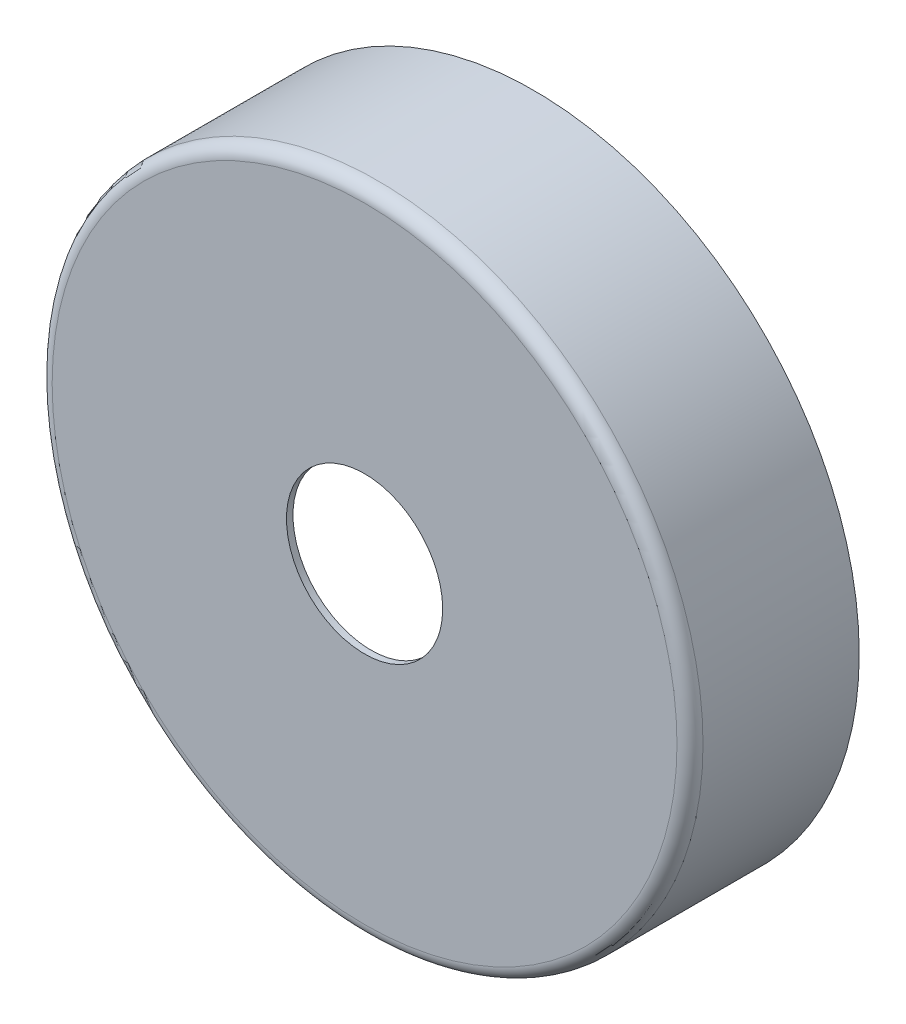
ISO-10303-21;
HEADER;
FILE_DESCRIPTION(('STEP AP214'),'2;1');
FILE_NAME('part.step','',(''),(''),'','','');
FILE_SCHEMA(('AUTOMOTIVE_DESIGN { 1 0 10303 214 1 1 1 1 }'));
ENDSEC;
DATA;
#1=APPLICATION_CONTEXT('core data for automotive mechanical design processes');
#2=APPLICATION_PROTOCOL_DEFINITION('international standard','automotive_design',2000,#1);
#3=PRODUCT_CONTEXT('',#1,'mechanical');
#4=PRODUCT('Part','Part','',(#3));
#5=PRODUCT_RELATED_PRODUCT_CATEGORY('part','',(#4));
#6=PRODUCT_DEFINITION_FORMATION('','',#4);
#7=PRODUCT_DEFINITION_CONTEXT('part definition',#1,'design');
#8=PRODUCT_DEFINITION('design','',#6,#7);
#9=PRODUCT_DEFINITION_SHAPE('','',#8);
#10=(LENGTH_UNIT() NAMED_UNIT(*) SI_UNIT(.MILLI.,.METRE.));
#11=(NAMED_UNIT(*) PLANE_ANGLE_UNIT() SI_UNIT($,.RADIAN.));
#12=(NAMED_UNIT(*) SI_UNIT($,.STERADIAN.) SOLID_ANGLE_UNIT());
#13=UNCERTAINTY_MEASURE_WITH_UNIT(LENGTH_MEASURE(1.E-05),#10,'distance_accuracy_value','');
#14=(GEOMETRIC_REPRESENTATION_CONTEXT(3) GLOBAL_UNCERTAINTY_ASSIGNED_CONTEXT((#13)) GLOBAL_UNIT_ASSIGNED_CONTEXT((#10,
#11,#12)) REPRESENTATION_CONTEXT('',''));
#15=CARTESIAN_POINT('',(0.,0.,0.));
#16=DIRECTION('',(0.,0.,1.));
#17=DIRECTION('',(1.,0.,0.));
#18=AXIS2_PLACEMENT_3D('',#15,#16,#17);
#19=CARTESIAN_POINT('',(0.,0.,0.));
#20=DIRECTION('',(0.,0.,1.));
#21=DIRECTION('',(1.,0.,0.));
#22=AXIS2_PLACEMENT_3D('',#19,#20,#21);
#23=PLANE('',#22);
#24=CARTESIAN_POINT('',(0.,0.,0.));
#25=DIRECTION('',(0.,0.,1.));
#26=DIRECTION('',(1.,0.,0.));
#27=AXIS2_PLACEMENT_3D('',#24,#25,#26);
#28=CIRCLE('',#27,24.5);
#29=CARTESIAN_POINT('',(-24.5,0.,0.));
#30=VERTEX_POINT('',#29);
#31=EDGE_CURVE('E81',#30,#30,#28,.T.);
#32=ORIENTED_EDGE('',*,*,#31,.T.);
#33=EDGE_LOOP('',(#32));
#34=FACE_BOUND('',#33,.T.);
#35=CARTESIAN_POINT('',(0.,0.,0.));
#36=DIRECTION('',(0.,0.,1.));
#37=DIRECTION('',(1.,0.,0.));
#38=AXIS2_PLACEMENT_3D('',#35,#36,#37);
#39=CIRCLE('',#38,25.);
#40=CARTESIAN_POINT('',(-25.,0.,0.));
#41=VERTEX_POINT('',#40);
#42=EDGE_CURVE('E11',#41,#41,#39,.T.);
#43=ORIENTED_EDGE('',*,*,#42,.F.);
#44=EDGE_LOOP('',(#43));
#45=FACE_BOUND('',#44,.T.);
#46=ADVANCED_FACE('F17',(#34,#45),#23,.F.);
#47=CARTESIAN_POINT('',(0.,0.,13.));
#48=DIRECTION('',(0.,0.,1.));
#49=DIRECTION('',(1.,0.,0.));
#50=AXIS2_PLACEMENT_3D('',#47,#48,#49);
#51=PLANE('',#50);
#52=CARTESIAN_POINT('',(0.,0.,13.));
#53=DIRECTION('',(0.,0.,-1.));
#54=DIRECTION('',(-1.,0.,0.));
#55=AXIS2_PLACEMENT_3D('',#52,#53,#54);
#56=CIRCLE('',#55,6.);
#57=CARTESIAN_POINT('',(6.,0.,13.));
#58=VERTEX_POINT('',#57);
#59=EDGE_CURVE('E64',#58,#58,#56,.T.);
#60=ORIENTED_EDGE('',*,*,#59,.T.);
#61=EDGE_LOOP('',(#60));
#62=FACE_BOUND('',#61,.T.);
#63=CARTESIAN_POINT('',(0.,0.,13.));
#64=DIRECTION('',(0.,0.,-1.));
#65=DIRECTION('',(1.,0.,0.));
#66=AXIS2_PLACEMENT_3D('',#63,#64,#65);
#67=CIRCLE('',#66,24.);
#68=CARTESIAN_POINT('',(-24.,0.,13.));
#69=VERTEX_POINT('',#68);
#70=EDGE_CURVE('E21',#69,#69,#67,.T.);
#71=ORIENTED_EDGE('',*,*,#70,.F.);
#72=EDGE_LOOP('',(#71));
#73=FACE_BOUND('',#72,.T.);
#74=ADVANCED_FACE('F65',(#62,#73),#51,.T.);
#75=CARTESIAN_POINT('',(0.,0.,0.));
#76=DIRECTION('',(0.,0.,1.));
#77=DIRECTION('',(1.,0.,0.));
#78=AXIS2_PLACEMENT_3D('',#75,#76,#77);
#79=CYLINDRICAL_SURFACE('',#78,25.);
#80=CARTESIAN_POINT('',(0.,0.,12.));
#81=DIRECTION('',(0.,0.,1.));
#82=DIRECTION('',(1.,0.,0.));
#83=AXIS2_PLACEMENT_3D('',#80,#81,#82);
#84=CIRCLE('',#83,25.);
#85=CARTESIAN_POINT('',(-25.,0.,12.));
#86=VERTEX_POINT('',#85);
#87=EDGE_CURVE('E83',#86,#86,#84,.T.);
#88=ORIENTED_EDGE('',*,*,#87,.F.);
#89=EDGE_LOOP('',(#88));
#90=FACE_BOUND('',#89,.T.);
#91=ORIENTED_EDGE('',*,*,#42,.T.);
#92=EDGE_LOOP('',(#91));
#93=FACE_BOUND('',#92,.T.);
#94=ADVANCED_FACE('F95',(#90,#93),#79,.T.);
#95=CARTESIAN_POINT('',(0.,0.,12.));
#96=DIRECTION('',(0.,0.,1.));
#97=DIRECTION('',(1.,0.,0.));
#98=AXIS2_PLACEMENT_3D('',#95,#96,#97);
#99=TOROIDAL_SURFACE('',#98,24.,1.);
#100=ORIENTED_EDGE('',*,*,#70,.T.);
#101=EDGE_LOOP('',(#100));
#102=FACE_BOUND('',#101,.T.);
#103=ORIENTED_EDGE('',*,*,#87,.T.);
#104=EDGE_LOOP('',(#103));
#105=FACE_BOUND('',#104,.T.);
#106=ADVANCED_FACE('F93',(#102,#105),#99,.T.);
#107=CARTESIAN_POINT('',(0.,0.,12.5));
#108=DIRECTION('',(0.,0.,1.));
#109=DIRECTION('',(1.,0.,0.));
#110=AXIS2_PLACEMENT_3D('',#107,#108,#109);
#111=PLANE('',#110);
#112=CARTESIAN_POINT('',(0.,0.,12.5));
#113=DIRECTION('',(0.,0.,1.));
#114=DIRECTION('',(-1.,0.,0.));
#115=AXIS2_PLACEMENT_3D('',#112,#113,#114);
#116=CIRCLE('',#115,6.);
#117=CARTESIAN_POINT('',(6.,0.,12.5));
#118=VERTEX_POINT('',#117);
#119=EDGE_CURVE('E70',#118,#118,#116,.T.);
#120=ORIENTED_EDGE('',*,*,#119,.T.);
#121=EDGE_LOOP('',(#120));
#122=FACE_BOUND('',#121,.T.);
#123=CARTESIAN_POINT('',(0.,0.,12.5));
#124=DIRECTION('',(0.,0.,-1.));
#125=DIRECTION('',(1.,0.,0.));
#126=AXIS2_PLACEMENT_3D('',#123,#124,#125);
#127=CIRCLE('',#126,24.);
#128=CARTESIAN_POINT('',(-24.,0.,12.5));
#129=VERTEX_POINT('',#128);
#130=EDGE_CURVE('E74',#129,#129,#127,.T.);
#131=ORIENTED_EDGE('',*,*,#130,.T.);
#132=EDGE_LOOP('',(#131));
#133=FACE_BOUND('',#132,.T.);
#134=ADVANCED_FACE('F19',(#122,#133),#111,.F.);
#135=CARTESIAN_POINT('',(0.,0.,0.));
#136=DIRECTION('',(0.,0.,1.));
#137=DIRECTION('',(1.,0.,0.));
#138=AXIS2_PLACEMENT_3D('',#135,#136,#137);
#139=CYLINDRICAL_SURFACE('',#138,24.5);
#140=CARTESIAN_POINT('',(0.,0.,12.));
#141=DIRECTION('',(0.,0.,1.));
#142=DIRECTION('',(1.,0.,0.));
#143=AXIS2_PLACEMENT_3D('',#140,#141,#142);
#144=CIRCLE('',#143,24.5);
#145=CARTESIAN_POINT('',(-24.5,0.,12.));
#146=VERTEX_POINT('',#145);
#147=EDGE_CURVE('E69',#146,#146,#144,.T.);
#148=ORIENTED_EDGE('',*,*,#147,.T.);
#149=EDGE_LOOP('',(#148));
#150=FACE_BOUND('',#149,.T.);
#151=ORIENTED_EDGE('',*,*,#31,.F.);
#152=EDGE_LOOP('',(#151));
#153=FACE_BOUND('',#152,.T.);
#154=ADVANCED_FACE('F113',(#150,#153),#139,.F.);
#155=CARTESIAN_POINT('',(0.,0.,12.));
#156=DIRECTION('',(0.,0.,1.));
#157=DIRECTION('',(1.,0.,0.));
#158=AXIS2_PLACEMENT_3D('',#155,#156,#157);
#159=TOROIDAL_SURFACE('',#158,24.,0.5);
#160=ORIENTED_EDGE('',*,*,#130,.F.);
#161=EDGE_LOOP('',(#160));
#162=FACE_BOUND('',#161,.T.);
#163=ORIENTED_EDGE('',*,*,#147,.F.);
#164=EDGE_LOOP('',(#163));
#165=FACE_BOUND('',#164,.T.);
#166=ADVANCED_FACE('F109',(#162,#165),#159,.F.);
#167=CARTESIAN_POINT('',(0.,0.,13.));
#168=DIRECTION('',(0.,0.,-1.));
#169=DIRECTION('',(-1.,0.,0.));
#170=AXIS2_PLACEMENT_3D('',#167,#168,#169);
#171=CYLINDRICAL_SURFACE('',#170,6.);
#172=ORIENTED_EDGE('',*,*,#59,.F.);
#173=EDGE_LOOP('',(#172));
#174=FACE_BOUND('',#173,.T.);
#175=ORIENTED_EDGE('',*,*,#119,.F.);
#176=EDGE_LOOP('',(#175));
#177=FACE_BOUND('',#176,.T.);
#178=ADVANCED_FACE('F107',(#174,#177),#171,.F.);
#179=CLOSED_SHELL('',(#46,#74,#94,#106,#134,#154,#166,#178));
#180=MANIFOLD_SOLID_BREP('B1',#179);
#181=ADVANCED_BREP_SHAPE_REPRESENTATION('',(#18,#180),#14);
#182=SHAPE_DEFINITION_REPRESENTATION(#9,#181);
ENDSEC;
END-ISO-10303-21;
